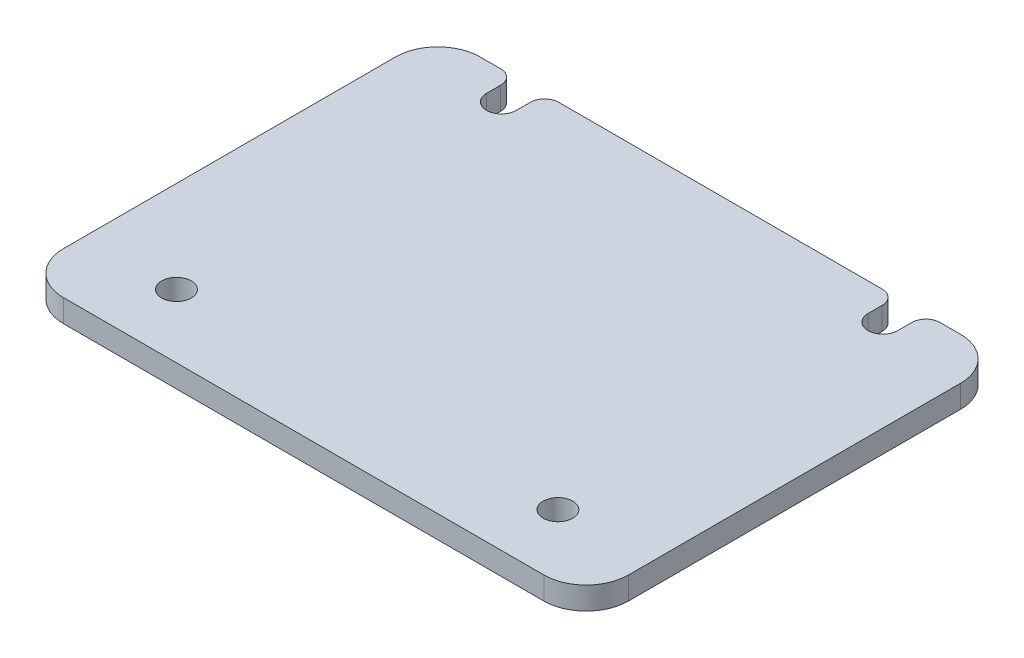
ISO-10303-21;
HEADER;
FILE_DESCRIPTION(('STEP AP214'),'2;1');
FILE_NAME('part.step','',(''),(''),'','','');
FILE_SCHEMA(('AUTOMOTIVE_DESIGN { 1 0 10303 214 1 1 1 1 }'));
ENDSEC;
DATA;
#1=APPLICATION_CONTEXT('core data for automotive mechanical design processes');
#2=APPLICATION_PROTOCOL_DEFINITION('international standard','automotive_design',2000,#1);
#3=PRODUCT_CONTEXT('',#1,'mechanical');
#4=PRODUCT('Part','Part','',(#3));
#5=PRODUCT_RELATED_PRODUCT_CATEGORY('part','',(#4));
#6=PRODUCT_DEFINITION_FORMATION('','',#4);
#7=PRODUCT_DEFINITION_CONTEXT('part definition',#1,'design');
#8=PRODUCT_DEFINITION('design','',#6,#7);
#9=PRODUCT_DEFINITION_SHAPE('','',#8);
#10=(LENGTH_UNIT() NAMED_UNIT(*) SI_UNIT(.MILLI.,.METRE.));
#11=(NAMED_UNIT(*) PLANE_ANGLE_UNIT() SI_UNIT($,.RADIAN.));
#12=(NAMED_UNIT(*) SI_UNIT($,.STERADIAN.) SOLID_ANGLE_UNIT());
#13=UNCERTAINTY_MEASURE_WITH_UNIT(LENGTH_MEASURE(1.E-05),#10,'distance_accuracy_value','');
#14=(GEOMETRIC_REPRESENTATION_CONTEXT(3) GLOBAL_UNCERTAINTY_ASSIGNED_CONTEXT((#13)) GLOBAL_UNIT_ASSIGNED_CONTEXT((#10,
#11,#12)) REPRESENTATION_CONTEXT('',''));
#15=CARTESIAN_POINT('',(0.,0.,0.));
#16=DIRECTION('',(0.,0.,1.));
#17=DIRECTION('',(1.,0.,0.));
#18=AXIS2_PLACEMENT_3D('',#15,#16,#17);
#19=CARTESIAN_POINT('',(-20.,1.6,-14.75));
#20=DIRECTION('',(0.,0.,1.));
#21=DIRECTION('',(1.,0.,0.));
#22=AXIS2_PLACEMENT_3D('',#19,#20,#21);
#23=PLANE('',#22);
#24=DIRECTION('',(-1.,0.,0.));
#25=VECTOR('',#24,1.);
#26=CARTESIAN_POINT('',(-20.,1.6,-14.75));
#27=LINE('',#26,#25);
#28=CARTESIAN_POINT('',(-15.55,1.6,-14.75));
#29=VERTEX_POINT('',#28);
#30=CARTESIAN_POINT('',(-17.,1.6,-14.75));
#31=VERTEX_POINT('',#30);
#32=EDGE_CURVE('E272',#29,#31,#27,.T.);
#33=ORIENTED_EDGE('',*,*,#32,.F.);
#34=DIRECTION('',(0.,-1.,0.));
#35=VECTOR('',#34,1.);
#36=CARTESIAN_POINT('',(-15.55,1.6,-14.75));
#37=LINE('',#36,#35);
#38=CARTESIAN_POINT('',(-15.55,0.,-14.75));
#39=VERTEX_POINT('',#38);
#40=EDGE_CURVE('E50',#29,#39,#37,.T.);
#41=ORIENTED_EDGE('',*,*,#40,.T.);
#42=DIRECTION('',(-1.,0.,0.));
#43=VECTOR('',#42,1.);
#44=CARTESIAN_POINT('',(-20.,0.,-14.75));
#45=LINE('',#44,#43);
#46=CARTESIAN_POINT('',(-17.,0.,-14.75));
#47=VERTEX_POINT('',#46);
#48=EDGE_CURVE('E270',#39,#47,#45,.T.);
#49=ORIENTED_EDGE('',*,*,#48,.T.);
#50=DIRECTION('',(0.,-1.,0.));
#51=VECTOR('',#50,1.);
#52=CARTESIAN_POINT('',(-17.,1.6,-14.75));
#53=LINE('',#52,#51);
#54=EDGE_CURVE('E317',#47,#31,#53,.F.);
#55=ORIENTED_EDGE('',*,*,#54,.T.);
#56=EDGE_LOOP('',(#33,#41,#49,#55));
#57=FACE_BOUND('',#56,.T.);
#58=ADVANCED_FACE('F41',(#57),#23,.F.);
#59=CARTESIAN_POINT('',(11.45,0.,-14.75));
#60=VERTEX_POINT('',#59);
#61=CARTESIAN_POINT('',(-11.45,0.,-14.75));
#62=VERTEX_POINT('',#61);
#63=EDGE_CURVE('E279',#60,#62,#45,.T.);
#64=ORIENTED_EDGE('',*,*,#63,.T.);
#65=DIRECTION('',(0.,1.,0.));
#66=VECTOR('',#65,1.);
#67=CARTESIAN_POINT('',(-11.45,1.6,-14.75));
#68=LINE('',#67,#66);
#69=CARTESIAN_POINT('',(-11.45,1.6,-14.75));
#70=VERTEX_POINT('',#69);
#71=EDGE_CURVE('E226',#62,#70,#68,.T.);
#72=ORIENTED_EDGE('',*,*,#71,.T.);
#73=CARTESIAN_POINT('',(11.45,1.6,-14.75));
#74=VERTEX_POINT('',#73);
#75=EDGE_CURVE('E318',#74,#70,#27,.T.);
#76=ORIENTED_EDGE('',*,*,#75,.F.);
#77=DIRECTION('',(0.,-1.,0.));
#78=VECTOR('',#77,1.);
#79=CARTESIAN_POINT('',(11.45,1.6,-14.75));
#80=LINE('',#79,#78);
#81=EDGE_CURVE('E222',#74,#60,#80,.T.);
#82=ORIENTED_EDGE('',*,*,#81,.T.);
#83=EDGE_LOOP('',(#64,#72,#76,#82));
#84=FACE_BOUND('',#83,.T.);
#85=ADVANCED_FACE('F408',(#84),#23,.F.);
#86=CARTESIAN_POINT('',(13.5,1.6,-12.75));
#87=DIRECTION('',(0.,1.,0.));
#88=DIRECTION('',(0.,0.,1.));
#89=AXIS2_PLACEMENT_3D('',#86,#87,#88);
#90=CYLINDRICAL_SURFACE('',#89,1.04999999999999);
#91=DIRECTION('',(0.,1.,0.));
#92=VECTOR('',#91,1.);
#93=CARTESIAN_POINT('',(12.45,0.,-12.75));
#94=LINE('',#93,#92);
#95=CARTESIAN_POINT('',(12.45,0.,-12.75));
#96=VERTEX_POINT('',#95);
#97=CARTESIAN_POINT('',(12.45,1.6,-12.75));
#98=VERTEX_POINT('',#97);
#99=EDGE_CURVE('E629',#96,#98,#94,.T.);
#100=ORIENTED_EDGE('',*,*,#99,.T.);
#101=CARTESIAN_POINT('',(13.5,1.6,-12.75));
#102=DIRECTION('',(0.,1.,0.));
#103=DIRECTION('',(0.,0.,1.));
#104=AXIS2_PLACEMENT_3D('',#101,#102,#103);
#105=CIRCLE('',#104,1.04999999999999);
#106=CARTESIAN_POINT('',(14.55,1.6,-12.75));
#107=VERTEX_POINT('',#106);
#108=EDGE_CURVE('E208',#98,#107,#105,.T.);
#109=ORIENTED_EDGE('',*,*,#108,.T.);
#110=DIRECTION('',(0.,1.,0.));
#111=VECTOR('',#110,1.);
#112=CARTESIAN_POINT('',(14.55,0.,-12.75));
#113=LINE('',#112,#111);
#114=CARTESIAN_POINT('',(14.55,0.,-12.75));
#115=VERTEX_POINT('',#114);
#116=EDGE_CURVE('E632',#115,#107,#113,.T.);
#117=ORIENTED_EDGE('',*,*,#116,.F.);
#118=CARTESIAN_POINT('',(13.5,0.,-12.75));
#119=DIRECTION('',(0.,1.,0.));
#120=DIRECTION('',(0.,0.,1.));
#121=AXIS2_PLACEMENT_3D('',#118,#119,#120);
#122=CIRCLE('',#121,1.04999999999999);
#123=EDGE_CURVE('E214',#96,#115,#122,.T.);
#124=ORIENTED_EDGE('',*,*,#123,.F.);
#125=EDGE_LOOP('',(#100,#109,#117,#124));
#126=FACE_BOUND('',#125,.T.);
#127=ADVANCED_FACE('F414',(#126),#90,.F.);
#128=CARTESIAN_POINT('',(-13.5,1.6,-12.75));
#129=DIRECTION('',(0.,1.,0.));
#130=DIRECTION('',(0.,0.,1.));
#131=AXIS2_PLACEMENT_3D('',#128,#129,#130);
#132=CYLINDRICAL_SURFACE('',#131,1.04999999999999);
#133=DIRECTION('',(0.,1.,0.));
#134=VECTOR('',#133,1.);
#135=CARTESIAN_POINT('',(-14.55,0.,-12.75));
#136=LINE('',#135,#134);
#137=CARTESIAN_POINT('',(-14.55,0.,-12.75));
#138=VERTEX_POINT('',#137);
#139=CARTESIAN_POINT('',(-14.55,1.6,-12.75));
#140=VERTEX_POINT('',#139);
#141=EDGE_CURVE('E195',#138,#140,#136,.T.);
#142=ORIENTED_EDGE('',*,*,#141,.T.);
#143=CARTESIAN_POINT('',(-13.5,1.6,-12.75));
#144=DIRECTION('',(0.,1.,0.));
#145=DIRECTION('',(0.,0.,1.));
#146=AXIS2_PLACEMENT_3D('',#143,#144,#145);
#147=CIRCLE('',#146,1.04999999999999);
#148=CARTESIAN_POINT('',(-12.45,1.6,-12.75));
#149=VERTEX_POINT('',#148);
#150=EDGE_CURVE('E209',#140,#149,#147,.T.);
#151=ORIENTED_EDGE('',*,*,#150,.T.);
#152=DIRECTION('',(0.,1.,0.));
#153=VECTOR('',#152,1.);
#154=CARTESIAN_POINT('',(-12.45,0.,-12.75));
#155=LINE('',#154,#153);
#156=CARTESIAN_POINT('',(-12.45,0.,-12.75));
#157=VERTEX_POINT('',#156);
#158=EDGE_CURVE('E191',#157,#149,#155,.T.);
#159=ORIENTED_EDGE('',*,*,#158,.F.);
#160=CARTESIAN_POINT('',(-13.5,0.,-12.75));
#161=DIRECTION('',(0.,1.,0.));
#162=DIRECTION('',(0.,0.,1.));
#163=AXIS2_PLACEMENT_3D('',#160,#161,#162);
#164=CIRCLE('',#163,1.04999999999999);
#165=EDGE_CURVE('E185',#138,#157,#164,.T.);
#166=ORIENTED_EDGE('',*,*,#165,.F.);
#167=EDGE_LOOP('',(#142,#151,#159,#166));
#168=FACE_BOUND('',#167,.T.);
#169=ADVANCED_FACE('F206',(#168),#132,.F.);
#170=CARTESIAN_POINT('',(-20.,1.6,-14.75));
#171=DIRECTION('',(1.,0.,0.));
#172=DIRECTION('',(0.,0.,-1.));
#173=AXIS2_PLACEMENT_3D('',#170,#171,#172);
#174=PLANE('',#173);
#175=DIRECTION('',(0.,0.,1.));
#176=VECTOR('',#175,1.);
#177=CARTESIAN_POINT('',(-20.,0.,-14.75));
#178=LINE('',#177,#176);
#179=CARTESIAN_POINT('',(-20.,0.,-11.75));
#180=VERTEX_POINT('',#179);
#181=CARTESIAN_POINT('',(-20.,0.,11.75));
#182=VERTEX_POINT('',#181);
#183=EDGE_CURVE('E319',#180,#182,#178,.T.);
#184=ORIENTED_EDGE('',*,*,#183,.T.);
#185=DIRECTION('',(0.,-1.,0.));
#186=VECTOR('',#185,1.);
#187=CARTESIAN_POINT('',(-20.,1.6,11.75));
#188=LINE('',#187,#186);
#189=CARTESIAN_POINT('',(-20.,1.6,11.75));
#190=VERTEX_POINT('',#189);
#191=EDGE_CURVE('E227',#182,#190,#188,.F.);
#192=ORIENTED_EDGE('',*,*,#191,.T.);
#193=DIRECTION('',(0.,0.,1.));
#194=VECTOR('',#193,1.);
#195=CARTESIAN_POINT('',(-20.,1.6,-14.75));
#196=LINE('',#195,#194);
#197=CARTESIAN_POINT('',(-20.,1.6,-11.75));
#198=VERTEX_POINT('',#197);
#199=EDGE_CURVE('E291',#198,#190,#196,.T.);
#200=ORIENTED_EDGE('',*,*,#199,.F.);
#201=DIRECTION('',(0.,-1.,0.));
#202=VECTOR('',#201,1.);
#203=CARTESIAN_POINT('',(-20.,1.6,-11.75));
#204=LINE('',#203,#202);
#205=EDGE_CURVE('E342',#198,#180,#204,.T.);
#206=ORIENTED_EDGE('',*,*,#205,.T.);
#207=EDGE_LOOP('',(#184,#192,#200,#206));
#208=FACE_BOUND('',#207,.T.);
#209=ADVANCED_FACE('F354',(#208),#174,.F.);
#210=CARTESIAN_POINT('',(-20.,1.6,14.75));
#211=DIRECTION('',(0.,0.,-1.));
#212=DIRECTION('',(-1.,0.,0.));
#213=AXIS2_PLACEMENT_3D('',#210,#211,#212);
#214=PLANE('',#213);
#215=DIRECTION('',(1.,0.,0.));
#216=VECTOR('',#215,1.);
#217=CARTESIAN_POINT('',(-20.,0.,14.75));
#218=LINE('',#217,#216);
#219=CARTESIAN_POINT('',(-17.,0.,14.75));
#220=VERTEX_POINT('',#219);
#221=CARTESIAN_POINT('',(17.,0.,14.75));
#222=VERTEX_POINT('',#221);
#223=EDGE_CURVE('E287',#220,#222,#218,.T.);
#224=ORIENTED_EDGE('',*,*,#223,.T.);
#225=DIRECTION('',(0.,-1.,0.));
#226=VECTOR('',#225,1.);
#227=CARTESIAN_POINT('',(17.,1.6,14.75));
#228=LINE('',#227,#226);
#229=CARTESIAN_POINT('',(17.,1.6,14.75));
#230=VERTEX_POINT('',#229);
#231=EDGE_CURVE('E331',#222,#230,#228,.F.);
#232=ORIENTED_EDGE('',*,*,#231,.T.);
#233=DIRECTION('',(1.,0.,0.));
#234=VECTOR('',#233,1.);
#235=CARTESIAN_POINT('',(-20.,1.6,14.75));
#236=LINE('',#235,#234);
#237=CARTESIAN_POINT('',(-17.,1.6,14.75));
#238=VERTEX_POINT('',#237);
#239=EDGE_CURVE('E297',#238,#230,#236,.T.);
#240=ORIENTED_EDGE('',*,*,#239,.F.);
#241=DIRECTION('',(0.,-1.,0.));
#242=VECTOR('',#241,1.);
#243=CARTESIAN_POINT('',(-17.,1.6,14.75));
#244=LINE('',#243,#242);
#245=EDGE_CURVE('E333',#238,#220,#244,.T.);
#246=ORIENTED_EDGE('',*,*,#245,.T.);
#247=EDGE_LOOP('',(#224,#232,#240,#246));
#248=FACE_BOUND('',#247,.T.);
#249=ADVANCED_FACE('F329',(#248),#214,.F.);
#250=CARTESIAN_POINT('',(20.,1.6,-14.75));
#251=DIRECTION('',(-1.,0.,0.));
#252=DIRECTION('',(0.,0.,1.));
#253=AXIS2_PLACEMENT_3D('',#250,#251,#252);
#254=PLANE('',#253);
#255=DIRECTION('',(0.,0.,-1.));
#256=VECTOR('',#255,1.);
#257=CARTESIAN_POINT('',(20.,0.,-14.75));
#258=LINE('',#257,#256);
#259=CARTESIAN_POINT('',(20.,0.,11.75));
#260=VERTEX_POINT('',#259);
#261=CARTESIAN_POINT('',(20.,0.,-11.75));
#262=VERTEX_POINT('',#261);
#263=EDGE_CURVE('E280',#260,#262,#258,.T.);
#264=ORIENTED_EDGE('',*,*,#263,.T.);
#265=DIRECTION('',(0.,-1.,0.));
#266=VECTOR('',#265,1.);
#267=CARTESIAN_POINT('',(20.,1.6,-11.75));
#268=LINE('',#267,#266);
#269=CARTESIAN_POINT('',(20.,1.6,-11.75));
#270=VERTEX_POINT('',#269);
#271=EDGE_CURVE('E366',#262,#270,#268,.F.);
#272=ORIENTED_EDGE('',*,*,#271,.T.);
#273=DIRECTION('',(0.,0.,-1.));
#274=VECTOR('',#273,1.);
#275=CARTESIAN_POINT('',(20.,1.6,-14.75));
#276=LINE('',#275,#274);
#277=CARTESIAN_POINT('',(20.,1.6,11.75));
#278=VERTEX_POINT('',#277);
#279=EDGE_CURVE('E304',#278,#270,#276,.T.);
#280=ORIENTED_EDGE('',*,*,#279,.F.);
#281=DIRECTION('',(0.,-1.,0.));
#282=VECTOR('',#281,1.);
#283=CARTESIAN_POINT('',(20.,1.6,11.75));
#284=LINE('',#283,#282);
#285=EDGE_CURVE('E395',#278,#260,#284,.T.);
#286=ORIENTED_EDGE('',*,*,#285,.T.);
#287=EDGE_LOOP('',(#264,#272,#280,#286));
#288=FACE_BOUND('',#287,.T.);
#289=ADVANCED_FACE('F399',(#288),#254,.F.);
#290=CARTESIAN_POINT('',(17.,0.,-14.75));
#291=VERTEX_POINT('',#290);
#292=CARTESIAN_POINT('',(15.55,0.,-14.75));
#293=VERTEX_POINT('',#292);
#294=EDGE_CURVE('E282',#291,#293,#45,.T.);
#295=ORIENTED_EDGE('',*,*,#294,.T.);
#296=DIRECTION('',(0.,1.,0.));
#297=VECTOR('',#296,1.);
#298=CARTESIAN_POINT('',(15.55,1.6,-14.75));
#299=LINE('',#298,#297);
#300=CARTESIAN_POINT('',(15.55,1.6,-14.75));
#301=VERTEX_POINT('',#300);
#302=EDGE_CURVE('E256',#293,#301,#299,.T.);
#303=ORIENTED_EDGE('',*,*,#302,.T.);
#304=CARTESIAN_POINT('',(17.,1.6,-14.75));
#305=VERTEX_POINT('',#304);
#306=EDGE_CURVE('E313',#305,#301,#27,.T.);
#307=ORIENTED_EDGE('',*,*,#306,.F.);
#308=DIRECTION('',(0.,-1.,0.));
#309=VECTOR('',#308,1.);
#310=CARTESIAN_POINT('',(17.,1.6,-14.75));
#311=LINE('',#310,#309);
#312=EDGE_CURVE('E380',#305,#291,#311,.T.);
#313=ORIENTED_EDGE('',*,*,#312,.T.);
#314=EDGE_LOOP('',(#295,#303,#307,#313));
#315=FACE_BOUND('',#314,.T.);
#316=ADVANCED_FACE('F379',(#315),#23,.F.);
#317=CARTESIAN_POINT('',(0.,1.6,0.));
#318=DIRECTION('',(0.,1.,0.));
#319=DIRECTION('',(0.,0.,1.));
#320=AXIS2_PLACEMENT_3D('',#317,#318,#319);
#321=PLANE('',#320);
#322=ORIENTED_EDGE('',*,*,#75,.T.);
#323=CARTESIAN_POINT('',(-11.45,1.6,-13.75));
#324=DIRECTION('',(0.,1.,0.));
#325=DIRECTION('',(0.,0.,1.));
#326=AXIS2_PLACEMENT_3D('',#323,#324,#325);
#327=CIRCLE('',#326,1.);
#328=CARTESIAN_POINT('',(-12.45,1.6,-13.75));
#329=VERTEX_POINT('',#328);
#330=EDGE_CURVE('E240',#70,#329,#327,.T.);
#331=ORIENTED_EDGE('',*,*,#330,.T.);
#332=DIRECTION('',(0.,0.,-1.));
#333=VECTOR('',#332,1.);
#334=CARTESIAN_POINT('',(-12.45,1.6,0.));
#335=LINE('',#334,#333);
#336=EDGE_CURVE('E203',#149,#329,#335,.T.);
#337=ORIENTED_EDGE('',*,*,#336,.F.);
#338=ORIENTED_EDGE('',*,*,#150,.F.);
#339=DIRECTION('',(0.,0.,1.));
#340=VECTOR('',#339,1.);
#341=CARTESIAN_POINT('',(-14.55,1.6,0.));
#342=LINE('',#341,#340);
#343=CARTESIAN_POINT('',(-14.55,1.6,-13.75));
#344=VERTEX_POINT('',#343);
#345=EDGE_CURVE('E198',#344,#140,#342,.T.);
#346=ORIENTED_EDGE('',*,*,#345,.F.);
#347=CARTESIAN_POINT('',(-15.55,1.6,-13.75));
#348=DIRECTION('',(0.,1.,0.));
#349=DIRECTION('',(0.,0.,1.));
#350=AXIS2_PLACEMENT_3D('',#347,#348,#349);
#351=CIRCLE('',#350,1.);
#352=EDGE_CURVE('E231',#344,#29,#351,.T.);
#353=ORIENTED_EDGE('',*,*,#352,.T.);
#354=ORIENTED_EDGE('',*,*,#32,.T.);
#355=CARTESIAN_POINT('',(-17.,1.6,-11.75));
#356=DIRECTION('',(0.,1.,0.));
#357=DIRECTION('',(0.,0.,1.));
#358=AXIS2_PLACEMENT_3D('',#355,#356,#357);
#359=CIRCLE('',#358,3.);
#360=EDGE_CURVE('E361',#31,#198,#359,.T.);
#361=ORIENTED_EDGE('',*,*,#360,.T.);
#362=ORIENTED_EDGE('',*,*,#199,.T.);
#363=CARTESIAN_POINT('',(-17.,1.6,11.75));
#364=DIRECTION('',(0.,1.,0.));
#365=DIRECTION('',(0.,0.,1.));
#366=AXIS2_PLACEMENT_3D('',#363,#364,#365);
#367=CIRCLE('',#366,3.);
#368=EDGE_CURVE('E359',#190,#238,#367,.T.);
#369=ORIENTED_EDGE('',*,*,#368,.T.);
#370=ORIENTED_EDGE('',*,*,#239,.T.);
#371=CARTESIAN_POINT('',(17.,1.6,11.75));
#372=DIRECTION('',(0.,1.,0.));
#373=DIRECTION('',(0.,0.,1.));
#374=AXIS2_PLACEMENT_3D('',#371,#372,#373);
#375=CIRCLE('',#374,3.);
#376=EDGE_CURVE('E340',#230,#278,#375,.T.);
#377=ORIENTED_EDGE('',*,*,#376,.T.);
#378=ORIENTED_EDGE('',*,*,#279,.T.);
#379=CARTESIAN_POINT('',(17.,1.6,-11.75));
#380=DIRECTION('',(0.,1.,0.));
#381=DIRECTION('',(0.,0.,1.));
#382=AXIS2_PLACEMENT_3D('',#379,#380,#381);
#383=CIRCLE('',#382,3.);
#384=EDGE_CURVE('E348',#270,#305,#383,.T.);
#385=ORIENTED_EDGE('',*,*,#384,.T.);
#386=ORIENTED_EDGE('',*,*,#306,.T.);
#387=CARTESIAN_POINT('',(15.55,1.6,-13.75));
#388=DIRECTION('',(0.,1.,0.));
#389=DIRECTION('',(0.,0.,1.));
#390=AXIS2_PLACEMENT_3D('',#387,#388,#389);
#391=CIRCLE('',#390,1.);
#392=CARTESIAN_POINT('',(14.55,1.6,-13.75));
#393=VERTEX_POINT('',#392);
#394=EDGE_CURVE('E237',#301,#393,#391,.T.);
#395=ORIENTED_EDGE('',*,*,#394,.T.);
#396=DIRECTION('',(0.,0.,-1.));
#397=VECTOR('',#396,1.);
#398=CARTESIAN_POINT('',(14.55,1.6,0.));
#399=LINE('',#398,#397);
#400=EDGE_CURVE('E645',#107,#393,#399,.T.);
#401=ORIENTED_EDGE('',*,*,#400,.F.);
#402=ORIENTED_EDGE('',*,*,#108,.F.);
#403=DIRECTION('',(0.,0.,1.));
#404=VECTOR('',#403,1.);
#405=CARTESIAN_POINT('',(12.45,1.6,0.));
#406=LINE('',#405,#404);
#407=CARTESIAN_POINT('',(12.45,1.6,-13.75));
#408=VERTEX_POINT('',#407);
#409=EDGE_CURVE('E216',#408,#98,#406,.T.);
#410=ORIENTED_EDGE('',*,*,#409,.F.);
#411=CARTESIAN_POINT('',(11.45,1.6,-13.75));
#412=DIRECTION('',(0.,1.,0.));
#413=DIRECTION('',(0.,0.,1.));
#414=AXIS2_PLACEMENT_3D('',#411,#412,#413);
#415=CIRCLE('',#414,1.);
#416=EDGE_CURVE('E234',#408,#74,#415,.T.);
#417=ORIENTED_EDGE('',*,*,#416,.T.);
#418=EDGE_LOOP('',(#322,#331,#337,#338,#346,#353,#354,#361,#362,#369,#370,#377,#378,#385,#386,
#395,#401,#402,#410,#417));
#419=FACE_BOUND('',#418,.T.);
#420=CARTESIAN_POINT('',(13.5,1.6,10.25));
#421=DIRECTION('',(0.,1.,0.));
#422=DIRECTION('',(0.,0.,1.));
#423=AXIS2_PLACEMENT_3D('',#420,#421,#422);
#424=CIRCLE('',#423,1.04999999999999);
#425=CARTESIAN_POINT('',(13.5,1.6,11.3));
#426=VERTEX_POINT('',#425);
#427=EDGE_CURVE('E655',#426,#426,#424,.T.);
#428=ORIENTED_EDGE('',*,*,#427,.F.);
#429=EDGE_LOOP('',(#428));
#430=FACE_BOUND('',#429,.T.);
#431=CARTESIAN_POINT('',(-13.5,1.6,10.25));
#432=DIRECTION('',(0.,1.,0.));
#433=DIRECTION('',(0.,0.,1.));
#434=AXIS2_PLACEMENT_3D('',#431,#432,#433);
#435=CIRCLE('',#434,1.04999999999999);
#436=CARTESIAN_POINT('',(-13.5,1.6,11.3));
#437=VERTEX_POINT('',#436);
#438=EDGE_CURVE('E658',#437,#437,#435,.T.);
#439=ORIENTED_EDGE('',*,*,#438,.F.);
#440=EDGE_LOOP('',(#439));
#441=FACE_BOUND('',#440,.T.);
#442=ADVANCED_FACE('F373',(#419,#430,#441),#321,.T.);
#443=CARTESIAN_POINT('',(0.,0.,0.));
#444=DIRECTION('',(0.,1.,0.));
#445=DIRECTION('',(0.,0.,1.));
#446=AXIS2_PLACEMENT_3D('',#443,#444,#445);
#447=PLANE('',#446);
#448=DIRECTION('',(0.,0.,-1.));
#449=VECTOR('',#448,1.);
#450=CARTESIAN_POINT('',(-12.45,0.,-12.75));
#451=LINE('',#450,#449);
#452=CARTESIAN_POINT('',(-12.45,0.,-13.75));
#453=VERTEX_POINT('',#452);
#454=EDGE_CURVE('E192',#157,#453,#451,.T.);
#455=ORIENTED_EDGE('',*,*,#454,.T.);
#456=CARTESIAN_POINT('',(-11.45,0.,-13.75));
#457=DIRECTION('',(0.,1.,0.));
#458=DIRECTION('',(0.,0.,1.));
#459=AXIS2_PLACEMENT_3D('',#456,#457,#458);
#460=CIRCLE('',#459,1.);
#461=EDGE_CURVE('E253',#453,#62,#460,.F.);
#462=ORIENTED_EDGE('',*,*,#461,.T.);
#463=ORIENTED_EDGE('',*,*,#63,.F.);
#464=CARTESIAN_POINT('',(11.45,0.,-13.75));
#465=DIRECTION('',(0.,1.,0.));
#466=DIRECTION('',(0.,0.,1.));
#467=AXIS2_PLACEMENT_3D('',#464,#465,#466);
#468=CIRCLE('',#467,1.);
#469=CARTESIAN_POINT('',(12.45,0.,-13.75));
#470=VERTEX_POINT('',#469);
#471=EDGE_CURVE('E248',#60,#470,#468,.F.);
#472=ORIENTED_EDGE('',*,*,#471,.T.);
#473=DIRECTION('',(0.,0.,1.));
#474=VECTOR('',#473,1.);
#475=CARTESIAN_POINT('',(12.45,0.,-12.75));
#476=LINE('',#475,#474);
#477=EDGE_CURVE('E626',#470,#96,#476,.T.);
#478=ORIENTED_EDGE('',*,*,#477,.T.);
#479=ORIENTED_EDGE('',*,*,#123,.T.);
#480=DIRECTION('',(0.,0.,-1.));
#481=VECTOR('',#480,1.);
#482=CARTESIAN_POINT('',(14.55,0.,-12.75));
#483=LINE('',#482,#481);
#484=CARTESIAN_POINT('',(14.55,0.,-13.75));
#485=VERTEX_POINT('',#484);
#486=EDGE_CURVE('E633',#115,#485,#483,.T.);
#487=ORIENTED_EDGE('',*,*,#486,.T.);
#488=CARTESIAN_POINT('',(15.55,0.,-13.75));
#489=DIRECTION('',(0.,1.,0.));
#490=DIRECTION('',(0.,0.,1.));
#491=AXIS2_PLACEMENT_3D('',#488,#489,#490);
#492=CIRCLE('',#491,1.);
#493=EDGE_CURVE('E57',#485,#293,#492,.F.);
#494=ORIENTED_EDGE('',*,*,#493,.T.);
#495=ORIENTED_EDGE('',*,*,#294,.F.);
#496=CARTESIAN_POINT('',(17.,0.,-11.75));
#497=DIRECTION('',(0.,1.,0.));
#498=DIRECTION('',(0.,0.,1.));
#499=AXIS2_PLACEMENT_3D('',#496,#497,#498);
#500=CIRCLE('',#499,3.);
#501=EDGE_CURVE('E382',#291,#262,#500,.F.);
#502=ORIENTED_EDGE('',*,*,#501,.T.);
#503=ORIENTED_EDGE('',*,*,#263,.F.);
#504=CARTESIAN_POINT('',(17.,0.,11.75));
#505=DIRECTION('',(0.,1.,0.));
#506=DIRECTION('',(0.,0.,1.));
#507=AXIS2_PLACEMENT_3D('',#504,#505,#506);
#508=CIRCLE('',#507,3.);
#509=EDGE_CURVE('E338',#260,#222,#508,.F.);
#510=ORIENTED_EDGE('',*,*,#509,.T.);
#511=ORIENTED_EDGE('',*,*,#223,.F.);
#512=CARTESIAN_POINT('',(-17.,0.,11.75));
#513=DIRECTION('',(0.,1.,0.));
#514=DIRECTION('',(0.,0.,1.));
#515=AXIS2_PLACEMENT_3D('',#512,#513,#514);
#516=CIRCLE('',#515,3.);
#517=EDGE_CURVE('E358',#220,#182,#516,.F.);
#518=ORIENTED_EDGE('',*,*,#517,.T.);
#519=ORIENTED_EDGE('',*,*,#183,.F.);
#520=CARTESIAN_POINT('',(-17.,0.,-11.75));
#521=DIRECTION('',(0.,1.,0.));
#522=DIRECTION('',(0.,0.,1.));
#523=AXIS2_PLACEMENT_3D('',#520,#521,#522);
#524=CIRCLE('',#523,3.);
#525=EDGE_CURVE('E276',#180,#47,#524,.F.);
#526=ORIENTED_EDGE('',*,*,#525,.T.);
#527=ORIENTED_EDGE('',*,*,#48,.F.);
#528=CARTESIAN_POINT('',(-15.55,0.,-13.75));
#529=DIRECTION('',(0.,1.,0.));
#530=DIRECTION('',(0.,0.,1.));
#531=AXIS2_PLACEMENT_3D('',#528,#529,#530);
#532=CIRCLE('',#531,1.);
#533=CARTESIAN_POINT('',(-14.55,0.,-13.75));
#534=VERTEX_POINT('',#533);
#535=EDGE_CURVE('E187',#39,#534,#532,.F.);
#536=ORIENTED_EDGE('',*,*,#535,.T.);
#537=DIRECTION('',(0.,0.,1.));
#538=VECTOR('',#537,1.);
#539=CARTESIAN_POINT('',(-14.55,0.,-12.75));
#540=LINE('',#539,#538);
#541=EDGE_CURVE('E179',#534,#138,#540,.T.);
#542=ORIENTED_EDGE('',*,*,#541,.T.);
#543=ORIENTED_EDGE('',*,*,#165,.T.);
#544=EDGE_LOOP('',(#455,#462,#463,#472,#478,#479,#487,#494,#495,#502,#503,#510,#511,#518,#519,
#526,#527,#536,#542,#543));
#545=FACE_BOUND('',#544,.T.);
#546=CARTESIAN_POINT('',(13.5,0.,10.25));
#547=DIRECTION('',(0.,1.,0.));
#548=DIRECTION('',(0.,0.,1.));
#549=AXIS2_PLACEMENT_3D('',#546,#547,#548);
#550=CIRCLE('',#549,1.04999999999999);
#551=CARTESIAN_POINT('',(13.5,0.,11.3));
#552=VERTEX_POINT('',#551);
#553=EDGE_CURVE('E219',#552,#552,#550,.T.);
#554=ORIENTED_EDGE('',*,*,#553,.T.);
#555=EDGE_LOOP('',(#554));
#556=FACE_BOUND('',#555,.T.);
#557=CARTESIAN_POINT('',(-13.5,0.,10.25));
#558=DIRECTION('',(0.,1.,0.));
#559=DIRECTION('',(0.,0.,1.));
#560=AXIS2_PLACEMENT_3D('',#557,#558,#559);
#561=CIRCLE('',#560,1.04999999999999);
#562=CARTESIAN_POINT('',(-13.5,0.,11.3));
#563=VERTEX_POINT('',#562);
#564=EDGE_CURVE('E307',#563,#563,#561,.T.);
#565=ORIENTED_EDGE('',*,*,#564,.T.);
#566=EDGE_LOOP('',(#565));
#567=FACE_BOUND('',#566,.T.);
#568=ADVANCED_FACE('F182',(#545,#556,#567),#447,.F.);
#569=CARTESIAN_POINT('',(17.,1.6,-11.75));
#570=DIRECTION('',(0.,-1.,0.));
#571=DIRECTION('',(0.,0.,-1.));
#572=AXIS2_PLACEMENT_3D('',#569,#570,#571);
#573=CYLINDRICAL_SURFACE('',#572,3.);
#574=ORIENTED_EDGE('',*,*,#384,.F.);
#575=ORIENTED_EDGE('',*,*,#271,.F.);
#576=ORIENTED_EDGE('',*,*,#501,.F.);
#577=ORIENTED_EDGE('',*,*,#312,.F.);
#578=EDGE_LOOP('',(#574,#575,#576,#577));
#579=FACE_BOUND('',#578,.T.);
#580=ADVANCED_FACE('F381',(#579),#573,.T.);
#581=CARTESIAN_POINT('',(17.,1.6,11.75));
#582=DIRECTION('',(0.,-1.,0.));
#583=DIRECTION('',(0.,0.,-1.));
#584=AXIS2_PLACEMENT_3D('',#581,#582,#583);
#585=CYLINDRICAL_SURFACE('',#584,3.);
#586=ORIENTED_EDGE('',*,*,#376,.F.);
#587=ORIENTED_EDGE('',*,*,#231,.F.);
#588=ORIENTED_EDGE('',*,*,#509,.F.);
#589=ORIENTED_EDGE('',*,*,#285,.F.);
#590=EDGE_LOOP('',(#586,#587,#588,#589));
#591=FACE_BOUND('',#590,.T.);
#592=ADVANCED_FACE('F336',(#591),#585,.T.);
#593=CARTESIAN_POINT('',(-17.,1.6,11.75));
#594=DIRECTION('',(0.,-1.,0.));
#595=DIRECTION('',(0.,0.,-1.));
#596=AXIS2_PLACEMENT_3D('',#593,#594,#595);
#597=CYLINDRICAL_SURFACE('',#596,3.);
#598=ORIENTED_EDGE('',*,*,#368,.F.);
#599=ORIENTED_EDGE('',*,*,#191,.F.);
#600=ORIENTED_EDGE('',*,*,#517,.F.);
#601=ORIENTED_EDGE('',*,*,#245,.F.);
#602=EDGE_LOOP('',(#598,#599,#600,#601));
#603=FACE_BOUND('',#602,.T.);
#604=ADVANCED_FACE('F357',(#603),#597,.T.);
#605=CARTESIAN_POINT('',(-17.,1.6,-11.75));
#606=DIRECTION('',(0.,-1.,0.));
#607=DIRECTION('',(0.,0.,-1.));
#608=AXIS2_PLACEMENT_3D('',#605,#606,#607);
#609=CYLINDRICAL_SURFACE('',#608,3.);
#610=ORIENTED_EDGE('',*,*,#360,.F.);
#611=ORIENTED_EDGE('',*,*,#54,.F.);
#612=ORIENTED_EDGE('',*,*,#525,.F.);
#613=ORIENTED_EDGE('',*,*,#205,.F.);
#614=EDGE_LOOP('',(#610,#611,#612,#613));
#615=FACE_BOUND('',#614,.T.);
#616=ADVANCED_FACE('F425',(#615),#609,.T.);
#617=CARTESIAN_POINT('',(-13.5,1.6,10.25));
#618=DIRECTION('',(0.,1.,0.));
#619=DIRECTION('',(0.,0.,1.));
#620=AXIS2_PLACEMENT_3D('',#617,#618,#619);
#621=CYLINDRICAL_SURFACE('',#620,1.04999999999999);
#622=ORIENTED_EDGE('',*,*,#438,.T.);
#623=EDGE_LOOP('',(#622));
#624=FACE_BOUND('',#623,.T.);
#625=ORIENTED_EDGE('',*,*,#564,.F.);
#626=EDGE_LOOP('',(#625));
#627=FACE_BOUND('',#626,.T.);
#628=ADVANCED_FACE('F421',(#624,#627),#621,.F.);
#629=CARTESIAN_POINT('',(13.5,1.6,10.25));
#630=DIRECTION('',(0.,1.,0.));
#631=DIRECTION('',(0.,0.,1.));
#632=AXIS2_PLACEMENT_3D('',#629,#630,#631);
#633=CYLINDRICAL_SURFACE('',#632,1.04999999999999);
#634=ORIENTED_EDGE('',*,*,#427,.T.);
#635=EDGE_LOOP('',(#634));
#636=FACE_BOUND('',#635,.T.);
#637=ORIENTED_EDGE('',*,*,#553,.F.);
#638=EDGE_LOOP('',(#637));
#639=FACE_BOUND('',#638,.T.);
#640=ADVANCED_FACE('F424',(#636,#639),#633,.F.);
#641=CARTESIAN_POINT('',(-12.45,0.,-12.75));
#642=DIRECTION('',(1.,0.,0.));
#643=DIRECTION('',(0.,0.,-1.));
#644=AXIS2_PLACEMENT_3D('',#641,#642,#643);
#645=PLANE('',#644);
#646=ORIENTED_EDGE('',*,*,#336,.T.);
#647=DIRECTION('',(0.,1.,0.));
#648=VECTOR('',#647,1.);
#649=CARTESIAN_POINT('',(-12.45,0.,-13.75));
#650=LINE('',#649,#648);
#651=EDGE_CURVE('E243',#329,#453,#650,.F.);
#652=ORIENTED_EDGE('',*,*,#651,.T.);
#653=ORIENTED_EDGE('',*,*,#454,.F.);
#654=ORIENTED_EDGE('',*,*,#158,.T.);
#655=EDGE_LOOP('',(#646,#652,#653,#654));
#656=FACE_BOUND('',#655,.T.);
#657=ADVANCED_FACE('F429',(#656),#645,.F.);
#658=CARTESIAN_POINT('',(-14.55,0.,-12.75));
#659=DIRECTION('',(-1.,0.,0.));
#660=DIRECTION('',(0.,0.,1.));
#661=AXIS2_PLACEMENT_3D('',#658,#659,#660);
#662=PLANE('',#661);
#663=ORIENTED_EDGE('',*,*,#541,.F.);
#664=DIRECTION('',(0.,-1.,0.));
#665=VECTOR('',#664,1.);
#666=CARTESIAN_POINT('',(-14.55,0.,-13.75));
#667=LINE('',#666,#665);
#668=EDGE_CURVE('E11',#534,#344,#667,.F.);
#669=ORIENTED_EDGE('',*,*,#668,.T.);
#670=ORIENTED_EDGE('',*,*,#345,.T.);
#671=ORIENTED_EDGE('',*,*,#141,.F.);
#672=EDGE_LOOP('',(#663,#669,#670,#671));
#673=FACE_BOUND('',#672,.T.);
#674=ADVANCED_FACE('F196',(#673),#662,.F.);
#675=CARTESIAN_POINT('',(14.55,0.,-12.75));
#676=DIRECTION('',(1.,0.,0.));
#677=DIRECTION('',(0.,0.,-1.));
#678=AXIS2_PLACEMENT_3D('',#675,#676,#677);
#679=PLANE('',#678);
#680=ORIENTED_EDGE('',*,*,#400,.T.);
#681=DIRECTION('',(0.,1.,0.));
#682=VECTOR('',#681,1.);
#683=CARTESIAN_POINT('',(14.55,0.,-13.75));
#684=LINE('',#683,#682);
#685=EDGE_CURVE('E65',#393,#485,#684,.F.);
#686=ORIENTED_EDGE('',*,*,#685,.T.);
#687=ORIENTED_EDGE('',*,*,#486,.F.);
#688=ORIENTED_EDGE('',*,*,#116,.T.);
#689=EDGE_LOOP('',(#680,#686,#687,#688));
#690=FACE_BOUND('',#689,.T.);
#691=ADVANCED_FACE('F436',(#690),#679,.F.);
#692=CARTESIAN_POINT('',(12.45,0.,-12.75));
#693=DIRECTION('',(-1.,0.,0.));
#694=DIRECTION('',(0.,0.,1.));
#695=AXIS2_PLACEMENT_3D('',#692,#693,#694);
#696=PLANE('',#695);
#697=ORIENTED_EDGE('',*,*,#477,.F.);
#698=DIRECTION('',(0.,-1.,0.));
#699=VECTOR('',#698,1.);
#700=CARTESIAN_POINT('',(12.45,0.,-13.75));
#701=LINE('',#700,#699);
#702=EDGE_CURVE('E262',#470,#408,#701,.F.);
#703=ORIENTED_EDGE('',*,*,#702,.T.);
#704=ORIENTED_EDGE('',*,*,#409,.T.);
#705=ORIENTED_EDGE('',*,*,#99,.F.);
#706=EDGE_LOOP('',(#697,#703,#704,#705));
#707=FACE_BOUND('',#706,.T.);
#708=ADVANCED_FACE('F439',(#707),#696,.F.);
#709=CARTESIAN_POINT('',(-11.45,1.6,-13.75));
#710=DIRECTION('',(0.,1.,0.));
#711=DIRECTION('',(0.,0.,1.));
#712=AXIS2_PLACEMENT_3D('',#709,#710,#711);
#713=CYLINDRICAL_SURFACE('',#712,1.);
#714=ORIENTED_EDGE('',*,*,#461,.F.);
#715=ORIENTED_EDGE('',*,*,#651,.F.);
#716=ORIENTED_EDGE('',*,*,#330,.F.);
#717=ORIENTED_EDGE('',*,*,#71,.F.);
#718=EDGE_LOOP('',(#714,#715,#716,#717));
#719=FACE_BOUND('',#718,.T.);
#720=ADVANCED_FACE('F442',(#719),#713,.T.);
#721=CARTESIAN_POINT('',(15.55,1.6,-13.75));
#722=DIRECTION('',(0.,1.,0.));
#723=DIRECTION('',(0.,0.,1.));
#724=AXIS2_PLACEMENT_3D('',#721,#722,#723);
#725=CYLINDRICAL_SURFACE('',#724,1.);
#726=ORIENTED_EDGE('',*,*,#493,.F.);
#727=ORIENTED_EDGE('',*,*,#685,.F.);
#728=ORIENTED_EDGE('',*,*,#394,.F.);
#729=ORIENTED_EDGE('',*,*,#302,.F.);
#730=EDGE_LOOP('',(#726,#727,#728,#729));
#731=FACE_BOUND('',#730,.T.);
#732=ADVANCED_FACE('F466',(#731),#725,.T.);
#733=CARTESIAN_POINT('',(11.45,1.6,-13.75));
#734=DIRECTION('',(0.,-1.,0.));
#735=DIRECTION('',(0.,0.,-1.));
#736=AXIS2_PLACEMENT_3D('',#733,#734,#735);
#737=CYLINDRICAL_SURFACE('',#736,1.);
#738=ORIENTED_EDGE('',*,*,#416,.F.);
#739=ORIENTED_EDGE('',*,*,#702,.F.);
#740=ORIENTED_EDGE('',*,*,#471,.F.);
#741=ORIENTED_EDGE('',*,*,#81,.F.);
#742=EDGE_LOOP('',(#738,#739,#740,#741));
#743=FACE_BOUND('',#742,.T.);
#744=ADVANCED_FACE('F474',(#743),#737,.T.);
#745=CARTESIAN_POINT('',(-15.55,1.6,-13.75));
#746=DIRECTION('',(0.,-1.,0.));
#747=DIRECTION('',(0.,0.,-1.));
#748=AXIS2_PLACEMENT_3D('',#745,#746,#747);
#749=CYLINDRICAL_SURFACE('',#748,1.);
#750=ORIENTED_EDGE('',*,*,#352,.F.);
#751=ORIENTED_EDGE('',*,*,#668,.F.);
#752=ORIENTED_EDGE('',*,*,#535,.F.);
#753=ORIENTED_EDGE('',*,*,#40,.F.);
#754=EDGE_LOOP('',(#750,#751,#752,#753));
#755=FACE_BOUND('',#754,.T.);
#756=ADVANCED_FACE('F43',(#755),#749,.T.);
#757=CLOSED_SHELL('',(#58,#85,#127,#169,#209,#249,#289,#316,#442,#568,#580,#592,#604,#616,#628,
#640,#657,#674,#691,#708,#720,#732,#744,#756));
#758=MANIFOLD_SOLID_BREP('B2',#757);
#759=ADVANCED_BREP_SHAPE_REPRESENTATION('',(#18,#758),#14);
#760=SHAPE_DEFINITION_REPRESENTATION(#9,#759);
ENDSEC;
END-ISO-10303-21;
